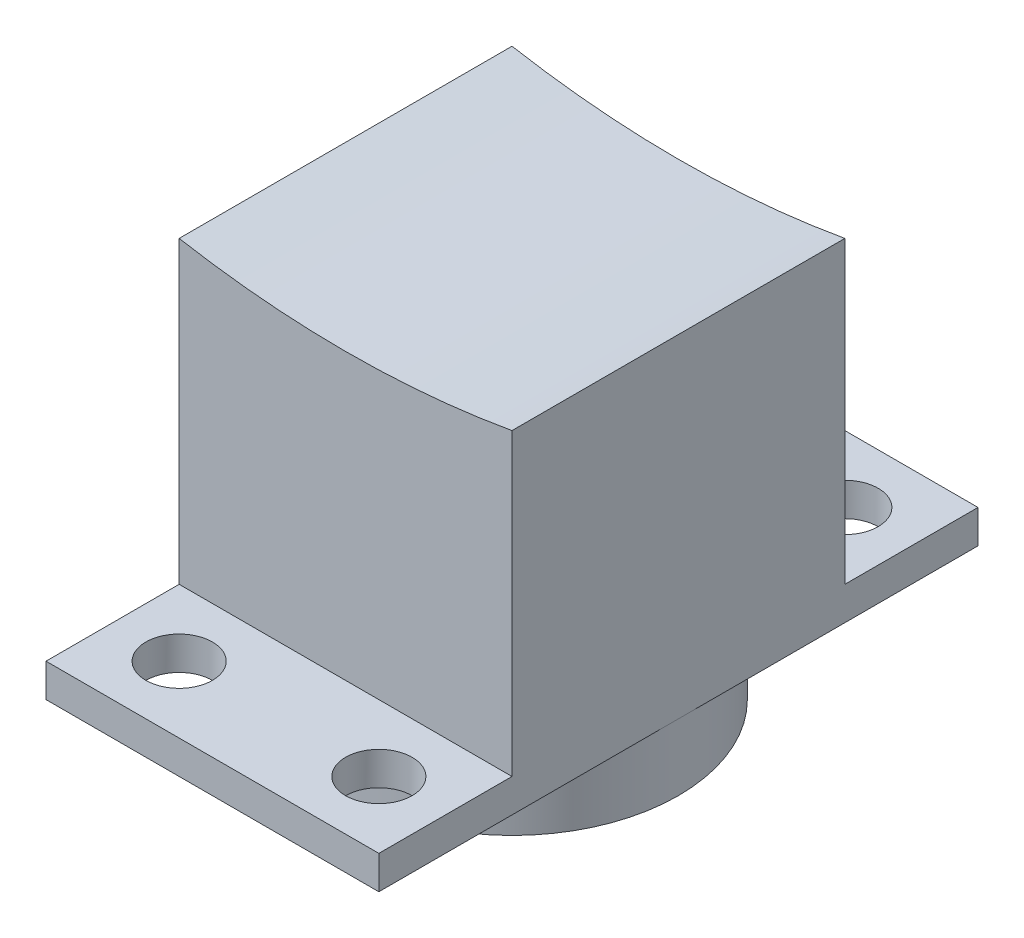
ISO-10303-21;
HEADER;
FILE_DESCRIPTION(('STEP AP214'),'2;1');
FILE_NAME('part.step','',(''),(''),'','','');
FILE_SCHEMA(('AUTOMOTIVE_DESIGN { 1 0 10303 214 1 1 1 1 }'));
ENDSEC;
DATA;
#1=APPLICATION_CONTEXT('core data for automotive mechanical design processes');
#2=APPLICATION_PROTOCOL_DEFINITION('international standard','automotive_design',2000,#1);
#3=PRODUCT_CONTEXT('',#1,'mechanical');
#4=PRODUCT('Part','Part','',(#3));
#5=PRODUCT_RELATED_PRODUCT_CATEGORY('part','',(#4));
#6=PRODUCT_DEFINITION_FORMATION('','',#4);
#7=PRODUCT_DEFINITION_CONTEXT('part definition',#1,'design');
#8=PRODUCT_DEFINITION('design','',#6,#7);
#9=PRODUCT_DEFINITION_SHAPE('','',#8);
#10=(LENGTH_UNIT() NAMED_UNIT(*) SI_UNIT(.MILLI.,.METRE.));
#11=(NAMED_UNIT(*) PLANE_ANGLE_UNIT() SI_UNIT($,.RADIAN.));
#12=(NAMED_UNIT(*) SI_UNIT($,.STERADIAN.) SOLID_ANGLE_UNIT());
#13=UNCERTAINTY_MEASURE_WITH_UNIT(LENGTH_MEASURE(1.E-05),#10,'distance_accuracy_value','');
#14=(GEOMETRIC_REPRESENTATION_CONTEXT(3) GLOBAL_UNCERTAINTY_ASSIGNED_CONTEXT((#13)) GLOBAL_UNIT_ASSIGNED_CONTEXT((#10,
#11,#12)) REPRESENTATION_CONTEXT('',''));
#15=CARTESIAN_POINT('',(0.,0.,0.));
#16=DIRECTION('',(0.,0.,1.));
#17=DIRECTION('',(1.,0.,0.));
#18=AXIS2_PLACEMENT_3D('',#15,#16,#17);
#19=CARTESIAN_POINT('',(25.,-25.,50.));
#20=DIRECTION('',(0.,1.,0.));
#21=DIRECTION('',(-1.,0.,0.));
#22=AXIS2_PLACEMENT_3D('',#19,#20,#21);
#23=PLANE('',#22);
#24=CARTESIAN_POINT('',(15.,-25.,60.));
#25=DIRECTION('',(0.,1.,0.));
#26=DIRECTION('',(-1.,0.,0.));
#27=AXIS2_PLACEMENT_3D('',#24,#25,#26);
#28=CIRCLE('',#27,5.);
#29=CARTESIAN_POINT('',(10.,-25.,60.));
#30=VERTEX_POINT('',#29);
#31=EDGE_CURVE('E261',#30,#30,#28,.T.);
#32=ORIENTED_EDGE('',*,*,#31,.T.);
#33=EDGE_LOOP('',(#32));
#34=FACE_BOUND('',#33,.T.);
#35=CARTESIAN_POINT('',(-15.,-25.,60.));
#36=DIRECTION('',(0.,1.,0.));
#37=DIRECTION('',(-1.,0.,0.));
#38=AXIS2_PLACEMENT_3D('',#35,#36,#37);
#39=CIRCLE('',#38,5.);
#40=CARTESIAN_POINT('',(-20.,-25.,60.));
#41=VERTEX_POINT('',#40);
#42=EDGE_CURVE('E263',#41,#41,#39,.T.);
#43=ORIENTED_EDGE('',*,*,#42,.T.);
#44=EDGE_LOOP('',(#43));
#45=FACE_BOUND('',#44,.T.);
#46=CARTESIAN_POINT('',(0.,-25.,25.));
#47=DIRECTION('',(0.,-1.,0.));
#48=DIRECTION('',(1.,0.,0.));
#49=AXIS2_PLACEMENT_3D('',#46,#47,#48);
#50=CIRCLE('',#49,25.);
#51=CARTESIAN_POINT('',(25.,-25.,25.));
#52=VERTEX_POINT('',#51);
#53=CARTESIAN_POINT('',(-25.,-25.,25.));
#54=VERTEX_POINT('',#53);
#55=EDGE_CURVE('E48',#52,#54,#50,.T.);
#56=ORIENTED_EDGE('',*,*,#55,.F.);
#57=DIRECTION('',(0.,0.,-1.));
#58=VECTOR('',#57,1.);
#59=CARTESIAN_POINT('',(25.,-25.,50.));
#60=LINE('',#59,#58);
#61=CARTESIAN_POINT('',(25.,-25.,70.));
#62=VERTEX_POINT('',#61);
#63=EDGE_CURVE('E125',#62,#52,#60,.T.);
#64=ORIENTED_EDGE('',*,*,#63,.F.);
#65=DIRECTION('',(1.,0.,0.));
#66=VECTOR('',#65,1.);
#67=CARTESIAN_POINT('',(-25.,-25.,70.));
#68=LINE('',#67,#66);
#69=CARTESIAN_POINT('',(-25.,-25.,70.));
#70=VERTEX_POINT('',#69);
#71=EDGE_CURVE('E123',#70,#62,#68,.T.);
#72=ORIENTED_EDGE('',*,*,#71,.F.);
#73=DIRECTION('',(0.,0.,-1.));
#74=VECTOR('',#73,1.);
#75=CARTESIAN_POINT('',(-25.,-25.,50.));
#76=LINE('',#75,#74);
#77=EDGE_CURVE('E110',#70,#54,#76,.T.);
#78=ORIENTED_EDGE('',*,*,#77,.T.);
#79=EDGE_LOOP('',(#56,#64,#72,#78));
#80=FACE_BOUND('',#79,.T.);
#81=ADVANCED_FACE('F39',(#34,#45,#80),#23,.F.);
#82=CARTESIAN_POINT('',(-25.,25.,50.));
#83=DIRECTION('',(1.,0.,0.));
#84=DIRECTION('',(0.,1.,0.));
#85=AXIS2_PLACEMENT_3D('',#82,#83,#84);
#86=PLANE('',#85);
#87=DIRECTION('',(0.,-1.,0.));
#88=VECTOR('',#87,1.);
#89=CARTESIAN_POINT('',(-25.,25.,0.));
#90=LINE('',#89,#88);
#91=CARTESIAN_POINT('',(-25.0000000000001,25.,0.));
#92=VERTEX_POINT('',#91);
#93=CARTESIAN_POINT('',(-25.,-20.,0.));
#94=VERTEX_POINT('',#93);
#95=EDGE_CURVE('E179',#92,#94,#90,.T.);
#96=ORIENTED_EDGE('',*,*,#95,.T.);
#97=DIRECTION('',(0.,0.,1.));
#98=VECTOR('',#97,1.);
#99=CARTESIAN_POINT('',(-25.,-20.,-20.));
#100=LINE('',#99,#98);
#101=CARTESIAN_POINT('',(-25.,-20.,-20.));
#102=VERTEX_POINT('',#101);
#103=EDGE_CURVE('E165',#102,#94,#100,.T.);
#104=ORIENTED_EDGE('',*,*,#103,.F.);
#105=DIRECTION('',(0.,-1.,0.));
#106=VECTOR('',#105,1.);
#107=CARTESIAN_POINT('',(-25.,-25.,-20.));
#108=LINE('',#107,#106);
#109=CARTESIAN_POINT('',(-25.,-25.,-20.));
#110=VERTEX_POINT('',#109);
#111=EDGE_CURVE('E149',#102,#110,#108,.T.);
#112=ORIENTED_EDGE('',*,*,#111,.T.);
#113=EDGE_CURVE('E117',#54,#110,#76,.T.);
#114=ORIENTED_EDGE('',*,*,#113,.F.);
#115=ORIENTED_EDGE('',*,*,#77,.F.);
#116=DIRECTION('',(0.,-1.,0.));
#117=VECTOR('',#116,1.);
#118=CARTESIAN_POINT('',(-25.,-25.,70.));
#119=LINE('',#118,#117);
#120=CARTESIAN_POINT('',(-25.,-20.,70.));
#121=VERTEX_POINT('',#120);
#122=EDGE_CURVE('E115',#121,#70,#119,.T.);
#123=ORIENTED_EDGE('',*,*,#122,.F.);
#124=CARTESIAN_POINT('',(-25.,-20.,50.));
#125=VERTEX_POINT('',#124);
#126=EDGE_CURVE('E168',#125,#121,#100,.T.);
#127=ORIENTED_EDGE('',*,*,#126,.F.);
#128=DIRECTION('',(0.,-1.,0.));
#129=VECTOR('',#128,1.);
#130=CARTESIAN_POINT('',(-25.,25.,50.));
#131=LINE('',#130,#129);
#132=CARTESIAN_POINT('',(-25.0000000000001,25.,50.));
#133=VERTEX_POINT('',#132);
#134=EDGE_CURVE('E60',#133,#125,#131,.T.);
#135=ORIENTED_EDGE('',*,*,#134,.F.);
#136=DIRECTION('',(0.,0.,-1.));
#137=VECTOR('',#136,1.);
#138=CARTESIAN_POINT('',(-25.0000000000001,25.,50.));
#139=LINE('',#138,#137);
#140=EDGE_CURVE('E191',#133,#92,#139,.T.);
#141=ORIENTED_EDGE('',*,*,#140,.T.);
#142=EDGE_LOOP('',(#96,#104,#112,#114,#115,#123,#127,#135,#141));
#143=FACE_BOUND('',#142,.T.);
#144=ADVANCED_FACE('F41',(#143),#86,.F.);
#145=CARTESIAN_POINT('',(-15.,-25.,-10.));
#146=DIRECTION('',(0.,1.,0.));
#147=DIRECTION('',(-1.,0.,0.));
#148=AXIS2_PLACEMENT_3D('',#145,#146,#147);
#149=CIRCLE('',#148,5.);
#150=CARTESIAN_POINT('',(-20.,-25.,-10.));
#151=VERTEX_POINT('',#150);
#152=EDGE_CURVE('E137',#151,#151,#149,.T.);
#153=ORIENTED_EDGE('',*,*,#152,.T.);
#154=EDGE_LOOP('',(#153));
#155=FACE_BOUND('',#154,.T.);
#156=CARTESIAN_POINT('',(15.,-25.,-10.));
#157=DIRECTION('',(0.,1.,0.));
#158=DIRECTION('',(-1.,0.,0.));
#159=AXIS2_PLACEMENT_3D('',#156,#157,#158);
#160=CIRCLE('',#159,5.);
#161=CARTESIAN_POINT('',(10.,-25.,-10.));
#162=VERTEX_POINT('',#161);
#163=EDGE_CURVE('E141',#162,#162,#160,.T.);
#164=ORIENTED_EDGE('',*,*,#163,.T.);
#165=EDGE_LOOP('',(#164));
#166=FACE_BOUND('',#165,.T.);
#167=EDGE_CURVE('E121',#54,#52,#50,.T.);
#168=ORIENTED_EDGE('',*,*,#167,.F.);
#169=ORIENTED_EDGE('',*,*,#113,.T.);
#170=DIRECTION('',(1.,0.,0.));
#171=VECTOR('',#170,1.);
#172=CARTESIAN_POINT('',(-25.,-25.,-20.));
#173=LINE('',#172,#171);
#174=CARTESIAN_POINT('',(25.,-25.,-20.));
#175=VERTEX_POINT('',#174);
#176=EDGE_CURVE('E152',#110,#175,#173,.T.);
#177=ORIENTED_EDGE('',*,*,#176,.T.);
#178=EDGE_CURVE('E206',#52,#175,#60,.T.);
#179=ORIENTED_EDGE('',*,*,#178,.F.);
#180=EDGE_LOOP('',(#168,#169,#177,#179));
#181=FACE_BOUND('',#180,.T.);
#182=ADVANCED_FACE('F221',(#155,#166,#181),#23,.F.);
#183=CARTESIAN_POINT('',(25.,25.,50.));
#184=DIRECTION('',(-1.,0.,0.));
#185=DIRECTION('',(0.,-1.,0.));
#186=AXIS2_PLACEMENT_3D('',#183,#184,#185);
#187=PLANE('',#186);
#188=DIRECTION('',(0.,1.,0.));
#189=VECTOR('',#188,1.);
#190=CARTESIAN_POINT('',(25.,25.,50.));
#191=LINE('',#190,#189);
#192=CARTESIAN_POINT('',(25.,-20.,50.));
#193=VERTEX_POINT('',#192);
#194=CARTESIAN_POINT('',(25.,25.,50.));
#195=VERTEX_POINT('',#194);
#196=EDGE_CURVE('E184',#193,#195,#191,.T.);
#197=ORIENTED_EDGE('',*,*,#196,.F.);
#198=DIRECTION('',(0.,0.,1.));
#199=VECTOR('',#198,1.);
#200=CARTESIAN_POINT('',(25.,-20.,-20.));
#201=LINE('',#200,#199);
#202=CARTESIAN_POINT('',(25.,-20.,70.));
#203=VERTEX_POINT('',#202);
#204=EDGE_CURVE('E164',#193,#203,#201,.T.);
#205=ORIENTED_EDGE('',*,*,#204,.T.);
#206=DIRECTION('',(0.,1.,0.));
#207=VECTOR('',#206,1.);
#208=CARTESIAN_POINT('',(25.,-25.,70.));
#209=LINE('',#208,#207);
#210=EDGE_CURVE('E130',#62,#203,#209,.T.);
#211=ORIENTED_EDGE('',*,*,#210,.F.);
#212=ORIENTED_EDGE('',*,*,#63,.T.);
#213=ORIENTED_EDGE('',*,*,#178,.T.);
#214=DIRECTION('',(0.,1.,0.));
#215=VECTOR('',#214,1.);
#216=CARTESIAN_POINT('',(25.,-25.,-20.));
#217=LINE('',#216,#215);
#218=CARTESIAN_POINT('',(25.,-20.,-20.));
#219=VERTEX_POINT('',#218);
#220=EDGE_CURVE('E156',#175,#219,#217,.T.);
#221=ORIENTED_EDGE('',*,*,#220,.T.);
#222=CARTESIAN_POINT('',(25.,-20.,0.));
#223=VERTEX_POINT('',#222);
#224=EDGE_CURVE('E169',#219,#223,#201,.T.);
#225=ORIENTED_EDGE('',*,*,#224,.T.);
#226=DIRECTION('',(0.,1.,0.));
#227=VECTOR('',#226,1.);
#228=CARTESIAN_POINT('',(25.,25.,0.));
#229=LINE('',#228,#227);
#230=CARTESIAN_POINT('',(25.,25.,0.));
#231=VERTEX_POINT('',#230);
#232=EDGE_CURVE('E194',#223,#231,#229,.T.);
#233=ORIENTED_EDGE('',*,*,#232,.T.);
#234=DIRECTION('',(0.,0.,-1.));
#235=VECTOR('',#234,1.);
#236=CARTESIAN_POINT('',(25.,25.,50.));
#237=LINE('',#236,#235);
#238=EDGE_CURVE('E202',#195,#231,#237,.T.);
#239=ORIENTED_EDGE('',*,*,#238,.F.);
#240=EDGE_LOOP('',(#197,#205,#211,#212,#213,#221,#225,#233,#239));
#241=FACE_BOUND('',#240,.T.);
#242=ADVANCED_FACE('F213',(#241),#187,.F.);
#243=CARTESIAN_POINT('',(0.,165.362432209108,50.));
#244=DIRECTION('',(0.,0.,-1.));
#245=DIRECTION('',(-1.,0.,0.));
#246=AXIS2_PLACEMENT_3D('',#243,#244,#245);
#247=CYLINDRICAL_SURFACE('',#246,142.57142903);
#248=CARTESIAN_POINT('',(0.,165.362432209108,0.));
#249=DIRECTION('',(0.,0.,-1.));
#250=DIRECTION('',(1.,0.,0.));
#251=AXIS2_PLACEMENT_3D('',#248,#249,#250);
#252=CIRCLE('',#251,142.57142903);
#253=EDGE_CURVE('E185',#231,#92,#252,.T.);
#254=ORIENTED_EDGE('',*,*,#253,.T.);
#255=ORIENTED_EDGE('',*,*,#140,.F.);
#256=CARTESIAN_POINT('',(0.,165.362432209108,50.));
#257=DIRECTION('',(0.,0.,-1.));
#258=DIRECTION('',(1.,0.,0.));
#259=AXIS2_PLACEMENT_3D('',#256,#257,#258);
#260=CIRCLE('',#259,142.57142903);
#261=EDGE_CURVE('E188',#195,#133,#260,.T.);
#262=ORIENTED_EDGE('',*,*,#261,.F.);
#263=ORIENTED_EDGE('',*,*,#238,.T.);
#264=EDGE_LOOP('',(#254,#255,#262,#263));
#265=FACE_BOUND('',#264,.T.);
#266=ADVANCED_FACE('F254',(#265),#247,.F.);
#267=CARTESIAN_POINT('',(0.,165.362432209108,50.));
#268=DIRECTION('',(0.,0.,1.));
#269=DIRECTION('',(1.,0.,0.));
#270=AXIS2_PLACEMENT_3D('',#267,#268,#269);
#271=PLANE('',#270);
#272=DIRECTION('',(-1.,0.,0.));
#273=VECTOR('',#272,1.);
#274=CARTESIAN_POINT('',(0.,-20.,50.));
#275=LINE('',#274,#273);
#276=EDGE_CURVE('E55',#193,#125,#275,.T.);
#277=ORIENTED_EDGE('',*,*,#276,.F.);
#278=ORIENTED_EDGE('',*,*,#196,.T.);
#279=ORIENTED_EDGE('',*,*,#261,.T.);
#280=ORIENTED_EDGE('',*,*,#134,.T.);
#281=EDGE_LOOP('',(#277,#278,#279,#280));
#282=FACE_BOUND('',#281,.T.);
#283=ADVANCED_FACE('F236',(#282),#271,.T.);
#284=CARTESIAN_POINT('',(0.,165.362432209108,0.));
#285=DIRECTION('',(0.,0.,1.));
#286=DIRECTION('',(1.,0.,0.));
#287=AXIS2_PLACEMENT_3D('',#284,#285,#286);
#288=PLANE('',#287);
#289=ORIENTED_EDGE('',*,*,#232,.F.);
#290=DIRECTION('',(-1.,0.,0.));
#291=VECTOR('',#290,1.);
#292=CARTESIAN_POINT('',(0.,-20.,0.));
#293=LINE('',#292,#291);
#294=EDGE_CURVE('E11',#223,#94,#293,.T.);
#295=ORIENTED_EDGE('',*,*,#294,.T.);
#296=ORIENTED_EDGE('',*,*,#95,.F.);
#297=ORIENTED_EDGE('',*,*,#253,.F.);
#298=EDGE_LOOP('',(#289,#295,#296,#297));
#299=FACE_BOUND('',#298,.T.);
#300=ADVANCED_FACE('F227',(#299),#288,.F.);
#301=CARTESIAN_POINT('',(0.,-35.,25.));
#302=DIRECTION('',(0.,1.,0.));
#303=DIRECTION('',(-1.,0.,0.));
#304=AXIS2_PLACEMENT_3D('',#301,#302,#303);
#305=CYLINDRICAL_SURFACE('',#304,25.);
#306=CARTESIAN_POINT('',(0.,-35.,25.));
#307=DIRECTION('',(0.,-1.,0.));
#308=DIRECTION('',(1.,0.,0.));
#309=AXIS2_PLACEMENT_3D('',#306,#307,#308);
#310=CIRCLE('',#309,25.);
#311=CARTESIAN_POINT('',(25.,-35.,25.));
#312=VERTEX_POINT('',#311);
#313=EDGE_CURVE('E175',#312,#312,#310,.T.);
#314=ORIENTED_EDGE('',*,*,#313,.F.);
#315=EDGE_LOOP('',(#314));
#316=FACE_BOUND('',#315,.T.);
#317=ORIENTED_EDGE('',*,*,#167,.T.);
#318=ORIENTED_EDGE('',*,*,#55,.T.);
#319=EDGE_LOOP('',(#317,#318));
#320=FACE_BOUND('',#319,.T.);
#321=ADVANCED_FACE('F224',(#316,#320),#305,.T.);
#322=CARTESIAN_POINT('',(0.,-35.,25.));
#323=DIRECTION('',(0.,-1.,0.));
#324=DIRECTION('',(1.,0.,0.));
#325=AXIS2_PLACEMENT_3D('',#322,#323,#324);
#326=PLANE('',#325);
#327=ORIENTED_EDGE('',*,*,#313,.T.);
#328=EDGE_LOOP('',(#327));
#329=FACE_BOUND('',#328,.T.);
#330=ADVANCED_FACE('F226',(#329),#326,.T.);
#331=CARTESIAN_POINT('',(0.,0.,-20.));
#332=DIRECTION('',(0.,0.,-1.));
#333=DIRECTION('',(-1.,0.,0.));
#334=AXIS2_PLACEMENT_3D('',#331,#332,#333);
#335=PLANE('',#334);
#336=ORIENTED_EDGE('',*,*,#111,.F.);
#337=DIRECTION('',(-1.,0.,0.));
#338=VECTOR('',#337,1.);
#339=CARTESIAN_POINT('',(-25.,-20.,-20.));
#340=LINE('',#339,#338);
#341=EDGE_CURVE('E160',#219,#102,#340,.T.);
#342=ORIENTED_EDGE('',*,*,#341,.F.);
#343=ORIENTED_EDGE('',*,*,#220,.F.);
#344=ORIENTED_EDGE('',*,*,#176,.F.);
#345=EDGE_LOOP('',(#336,#342,#343,#344));
#346=FACE_BOUND('',#345,.T.);
#347=ADVANCED_FACE('F220',(#346),#335,.T.);
#348=CARTESIAN_POINT('',(-25.,-20.,-20.));
#349=DIRECTION('',(0.,1.,0.));
#350=DIRECTION('',(0.,0.,1.));
#351=AXIS2_PLACEMENT_3D('',#348,#349,#350);
#352=PLANE('',#351);
#353=CARTESIAN_POINT('',(-15.,-20.,-10.));
#354=DIRECTION('',(0.,1.,0.));
#355=DIRECTION('',(0.,0.,1.));
#356=AXIS2_PLACEMENT_3D('',#353,#354,#355);
#357=CIRCLE('',#356,5.);
#358=CARTESIAN_POINT('',(-15.,-20.,-5.));
#359=VERTEX_POINT('',#358);
#360=EDGE_CURVE('E274',#359,#359,#357,.T.);
#361=ORIENTED_EDGE('',*,*,#360,.F.);
#362=EDGE_LOOP('',(#361));
#363=FACE_BOUND('',#362,.T.);
#364=CARTESIAN_POINT('',(15.,-20.,-10.));
#365=DIRECTION('',(0.,1.,0.));
#366=DIRECTION('',(0.,0.,1.));
#367=AXIS2_PLACEMENT_3D('',#364,#365,#366);
#368=CIRCLE('',#367,5.);
#369=CARTESIAN_POINT('',(15.,-20.,-5.));
#370=VERTEX_POINT('',#369);
#371=EDGE_CURVE('E278',#370,#370,#368,.T.);
#372=ORIENTED_EDGE('',*,*,#371,.F.);
#373=EDGE_LOOP('',(#372));
#374=FACE_BOUND('',#373,.T.);
#375=ORIENTED_EDGE('',*,*,#294,.F.);
#376=ORIENTED_EDGE('',*,*,#224,.F.);
#377=ORIENTED_EDGE('',*,*,#341,.T.);
#378=ORIENTED_EDGE('',*,*,#103,.T.);
#379=EDGE_LOOP('',(#375,#376,#377,#378));
#380=FACE_BOUND('',#379,.T.);
#381=ADVANCED_FACE('F292',(#363,#374,#380),#352,.T.);
#382=CARTESIAN_POINT('',(15.,-20.,60.));
#383=DIRECTION('',(0.,1.,0.));
#384=DIRECTION('',(0.,0.,1.));
#385=AXIS2_PLACEMENT_3D('',#382,#383,#384);
#386=CIRCLE('',#385,5.);
#387=CARTESIAN_POINT('',(15.,-20.,65.));
#388=VERTEX_POINT('',#387);
#389=EDGE_CURVE('E273',#388,#388,#386,.T.);
#390=ORIENTED_EDGE('',*,*,#389,.F.);
#391=EDGE_LOOP('',(#390));
#392=FACE_BOUND('',#391,.T.);
#393=CARTESIAN_POINT('',(-15.,-20.,60.));
#394=DIRECTION('',(0.,1.,0.));
#395=DIRECTION('',(0.,0.,1.));
#396=AXIS2_PLACEMENT_3D('',#393,#394,#395);
#397=CIRCLE('',#396,5.);
#398=CARTESIAN_POINT('',(-15.,-20.,65.));
#399=VERTEX_POINT('',#398);
#400=EDGE_CURVE('E269',#399,#399,#397,.T.);
#401=ORIENTED_EDGE('',*,*,#400,.F.);
#402=EDGE_LOOP('',(#401));
#403=FACE_BOUND('',#402,.T.);
#404=ORIENTED_EDGE('',*,*,#204,.F.);
#405=ORIENTED_EDGE('',*,*,#276,.T.);
#406=ORIENTED_EDGE('',*,*,#126,.T.);
#407=DIRECTION('',(-1.,0.,0.));
#408=VECTOR('',#407,1.);
#409=CARTESIAN_POINT('',(-25.,-20.,70.));
#410=LINE('',#409,#408);
#411=EDGE_CURVE('E135',#203,#121,#410,.T.);
#412=ORIENTED_EDGE('',*,*,#411,.F.);
#413=EDGE_LOOP('',(#404,#405,#406,#412));
#414=FACE_BOUND('',#413,.T.);
#415=ADVANCED_FACE('F289',(#392,#403,#414),#352,.T.);
#416=CARTESIAN_POINT('',(0.,0.,70.));
#417=DIRECTION('',(0.,0.,-1.));
#418=DIRECTION('',(-1.,0.,0.));
#419=AXIS2_PLACEMENT_3D('',#416,#417,#418);
#420=PLANE('',#419);
#421=ORIENTED_EDGE('',*,*,#122,.T.);
#422=ORIENTED_EDGE('',*,*,#71,.T.);
#423=ORIENTED_EDGE('',*,*,#210,.T.);
#424=ORIENTED_EDGE('',*,*,#411,.T.);
#425=EDGE_LOOP('',(#421,#422,#423,#424));
#426=FACE_BOUND('',#425,.T.);
#427=ADVANCED_FACE('F133',(#426),#420,.F.);
#428=CARTESIAN_POINT('',(-15.,-30.,60.));
#429=DIRECTION('',(0.,1.,0.));
#430=DIRECTION('',(0.,0.,1.));
#431=AXIS2_PLACEMENT_3D('',#428,#429,#430);
#432=CYLINDRICAL_SURFACE('',#431,5.);
#433=ORIENTED_EDGE('',*,*,#400,.T.);
#434=EDGE_LOOP('',(#433));
#435=FACE_BOUND('',#434,.T.);
#436=ORIENTED_EDGE('',*,*,#42,.F.);
#437=EDGE_LOOP('',(#436));
#438=FACE_BOUND('',#437,.T.);
#439=ADVANCED_FACE('F358',(#435,#438),#432,.F.);
#440=CARTESIAN_POINT('',(15.,-30.,60.));
#441=DIRECTION('',(0.,1.,0.));
#442=DIRECTION('',(0.,0.,1.));
#443=AXIS2_PLACEMENT_3D('',#440,#441,#442);
#444=CYLINDRICAL_SURFACE('',#443,5.);
#445=ORIENTED_EDGE('',*,*,#389,.T.);
#446=EDGE_LOOP('',(#445));
#447=FACE_BOUND('',#446,.T.);
#448=ORIENTED_EDGE('',*,*,#31,.F.);
#449=EDGE_LOOP('',(#448));
#450=FACE_BOUND('',#449,.T.);
#451=ADVANCED_FACE('F286',(#447,#450),#444,.F.);
#452=CARTESIAN_POINT('',(15.,-30.,-10.));
#453=DIRECTION('',(0.,1.,0.));
#454=DIRECTION('',(0.,0.,1.));
#455=AXIS2_PLACEMENT_3D('',#452,#453,#454);
#456=CYLINDRICAL_SURFACE('',#455,5.);
#457=ORIENTED_EDGE('',*,*,#371,.T.);
#458=EDGE_LOOP('',(#457));
#459=FACE_BOUND('',#458,.T.);
#460=ORIENTED_EDGE('',*,*,#163,.F.);
#461=EDGE_LOOP('',(#460));
#462=FACE_BOUND('',#461,.T.);
#463=ADVANCED_FACE('F397',(#459,#462),#456,.F.);
#464=CARTESIAN_POINT('',(-15.,-30.,-10.));
#465=DIRECTION('',(0.,1.,0.));
#466=DIRECTION('',(0.,0.,1.));
#467=AXIS2_PLACEMENT_3D('',#464,#465,#466);
#468=CYLINDRICAL_SURFACE('',#467,5.);
#469=ORIENTED_EDGE('',*,*,#360,.T.);
#470=EDGE_LOOP('',(#469));
#471=FACE_BOUND('',#470,.T.);
#472=ORIENTED_EDGE('',*,*,#152,.F.);
#473=EDGE_LOOP('',(#472));
#474=FACE_BOUND('',#473,.T.);
#475=ADVANCED_FACE('F406',(#471,#474),#468,.F.);
#476=CLOSED_SHELL('',(#81,#144,#182,#242,#266,#283,#300,#321,#330,#347,#381,#415,#427,#439,#451,
#463,#475));
#477=MANIFOLD_SOLID_BREP('B2',#476);
#478=ADVANCED_BREP_SHAPE_REPRESENTATION('',(#18,#477),#14);
#479=SHAPE_DEFINITION_REPRESENTATION(#9,#478);
ENDSEC;
END-ISO-10303-21;
